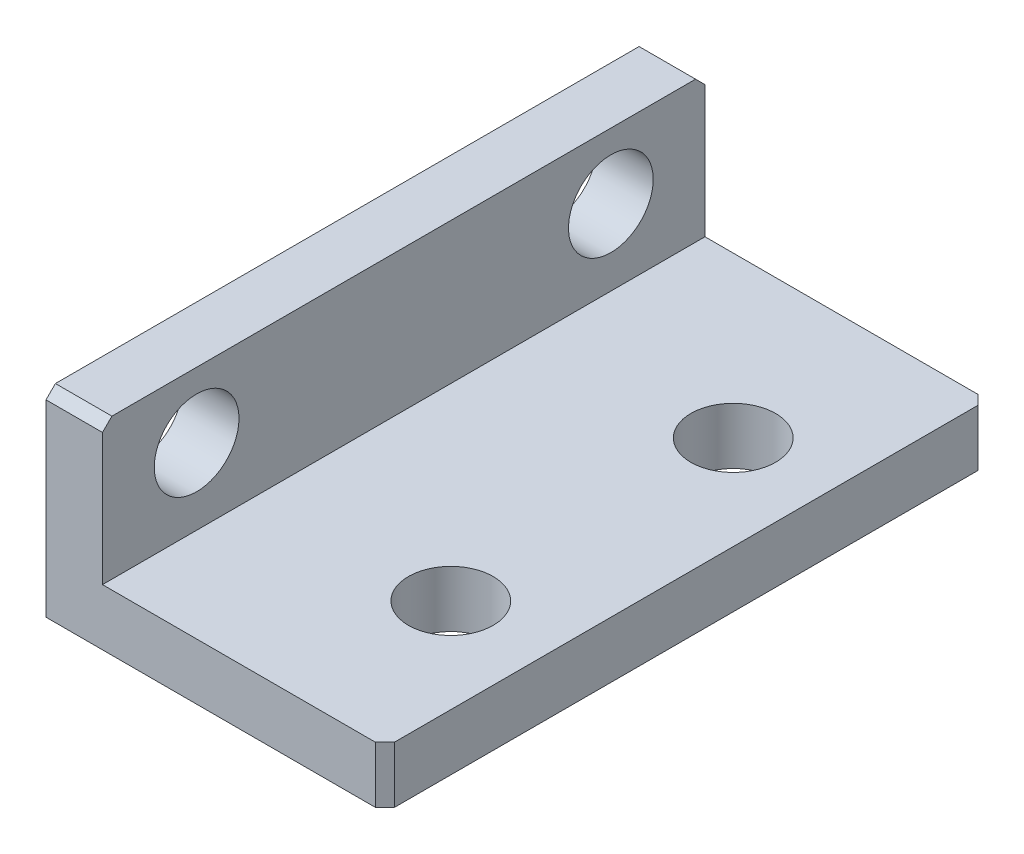
ISO-10303-21;
HEADER;
FILE_DESCRIPTION(('STEP AP214'),'2;1');
FILE_NAME('part.step','',(''),(''),'','','');
FILE_SCHEMA(('AUTOMOTIVE_DESIGN { 1 0 10303 214 1 1 1 1 }'));
ENDSEC;
DATA;
#1=APPLICATION_CONTEXT('core data for automotive mechanical design processes');
#2=APPLICATION_PROTOCOL_DEFINITION('international standard','automotive_design',2000,#1);
#3=PRODUCT_CONTEXT('',#1,'mechanical');
#4=PRODUCT('Part','Part','',(#3));
#5=PRODUCT_RELATED_PRODUCT_CATEGORY('part','',(#4));
#6=PRODUCT_DEFINITION_FORMATION('','',#4);
#7=PRODUCT_DEFINITION_CONTEXT('part definition',#1,'design');
#8=PRODUCT_DEFINITION('design','',#6,#7);
#9=PRODUCT_DEFINITION_SHAPE('','',#8);
#10=(LENGTH_UNIT() NAMED_UNIT(*) SI_UNIT(.MILLI.,.METRE.));
#11=(NAMED_UNIT(*) PLANE_ANGLE_UNIT() SI_UNIT($,.RADIAN.));
#12=(NAMED_UNIT(*) SI_UNIT($,.STERADIAN.) SOLID_ANGLE_UNIT());
#13=UNCERTAINTY_MEASURE_WITH_UNIT(LENGTH_MEASURE(1.E-05),#10,'distance_accuracy_value','');
#14=(GEOMETRIC_REPRESENTATION_CONTEXT(3) GLOBAL_UNCERTAINTY_ASSIGNED_CONTEXT((#13)) GLOBAL_UNIT_ASSIGNED_CONTEXT((#10,
#11,#12)) REPRESENTATION_CONTEXT('',''));
#15=CARTESIAN_POINT('',(0.,0.,0.));
#16=DIRECTION('',(0.,0.,1.));
#17=DIRECTION('',(1.,0.,0.));
#18=AXIS2_PLACEMENT_3D('',#15,#16,#17);
#19=CARTESIAN_POINT('',(0.,-3.,16.));
#20=DIRECTION('',(0.,1.,0.));
#21=DIRECTION('',(0.,0.,1.));
#22=AXIS2_PLACEMENT_3D('',#19,#20,#21);
#23=PLANE('',#22);
#24=CARTESIAN_POINT('',(10.,-3.,7.5));
#25=DIRECTION('',(0.,1.,0.));
#26=DIRECTION('',(0.,0.,1.));
#27=AXIS2_PLACEMENT_3D('',#24,#25,#26);
#28=CIRCLE('',#27,2.24999999999999);
#29=CARTESIAN_POINT('',(10.,-3.,9.74999999999999));
#30=VERTEX_POINT('',#29);
#31=EDGE_CURVE('E280',#30,#30,#28,.T.);
#32=ORIENTED_EDGE('',*,*,#31,.T.);
#33=EDGE_LOOP('',(#32));
#34=FACE_BOUND('',#33,.T.);
#35=CARTESIAN_POINT('',(10.,-3.,-7.5));
#36=DIRECTION('',(0.,1.,0.));
#37=DIRECTION('',(0.,0.,1.));
#38=AXIS2_PLACEMENT_3D('',#35,#36,#37);
#39=CIRCLE('',#38,2.24999999999999);
#40=CARTESIAN_POINT('',(10.,-3.,-5.25000000000001));
#41=VERTEX_POINT('',#40);
#42=EDGE_CURVE('E274',#41,#41,#39,.T.);
#43=ORIENTED_EDGE('',*,*,#42,.T.);
#44=EDGE_LOOP('',(#43));
#45=FACE_BOUND('',#44,.T.);
#46=DIRECTION('',(1.,0.,0.));
#47=VECTOR('',#46,1.);
#48=CARTESIAN_POINT('',(0.,-3.,-16.));
#49=LINE('',#48,#47);
#50=CARTESIAN_POINT('',(-3.,-3.,-16.));
#51=VERTEX_POINT('',#50);
#52=CARTESIAN_POINT('',(14.5,-3.,-16.));
#53=VERTEX_POINT('',#52);
#54=EDGE_CURVE('E148',#51,#53,#49,.T.);
#55=ORIENTED_EDGE('',*,*,#54,.T.);
#56=DIRECTION('',(-0.707106781186548,0.,-0.707106781186548));
#57=VECTOR('',#56,1.);
#58=CARTESIAN_POINT('',(14.5,-3.,-16.));
#59=LINE('',#58,#57);
#60=CARTESIAN_POINT('',(15.,-3.,-15.5));
#61=VERTEX_POINT('',#60);
#62=EDGE_CURVE('E173',#53,#61,#59,.F.);
#63=ORIENTED_EDGE('',*,*,#62,.T.);
#64=DIRECTION('',(0.,0.,-1.));
#65=VECTOR('',#64,1.);
#66=CARTESIAN_POINT('',(15.,-3.,16.));
#67=LINE('',#66,#65);
#68=CARTESIAN_POINT('',(15.,-3.,15.5));
#69=VERTEX_POINT('',#68);
#70=EDGE_CURVE('E162',#69,#61,#67,.T.);
#71=ORIENTED_EDGE('',*,*,#70,.F.);
#72=DIRECTION('',(-0.707106781186555,0.,0.70710678118654));
#73=VECTOR('',#72,1.);
#74=CARTESIAN_POINT('',(15.,-3.,15.5));
#75=LINE('',#74,#73);
#76=CARTESIAN_POINT('',(14.5,-3.,16.));
#77=VERTEX_POINT('',#76);
#78=EDGE_CURVE('E171',#69,#77,#75,.T.);
#79=ORIENTED_EDGE('',*,*,#78,.T.);
#80=DIRECTION('',(1.,0.,0.));
#81=VECTOR('',#80,1.);
#82=CARTESIAN_POINT('',(0.,-3.,16.));
#83=LINE('',#82,#81);
#84=CARTESIAN_POINT('',(-3.,-3.,16.));
#85=VERTEX_POINT('',#84);
#86=EDGE_CURVE('E140',#85,#77,#83,.T.);
#87=ORIENTED_EDGE('',*,*,#86,.F.);
#88=DIRECTION('',(0.,0.,-1.));
#89=VECTOR('',#88,1.);
#90=CARTESIAN_POINT('',(-3.,-3.,16.));
#91=LINE('',#90,#89);
#92=EDGE_CURVE('E147',#85,#51,#91,.T.);
#93=ORIENTED_EDGE('',*,*,#92,.T.);
#94=EDGE_LOOP('',(#55,#63,#71,#79,#87,#93));
#95=FACE_BOUND('',#94,.T.);
#96=ADVANCED_FACE('F35',(#34,#45,#95),#23,.F.);
#97=CARTESIAN_POINT('',(15.,0.,16.));
#98=DIRECTION('',(1.,0.,0.));
#99=DIRECTION('',(0.,0.,-1.));
#100=AXIS2_PLACEMENT_3D('',#97,#98,#99);
#101=PLANE('',#100);
#102=ORIENTED_EDGE('',*,*,#70,.T.);
#103=DIRECTION('',(0.,1.,0.));
#104=VECTOR('',#103,1.);
#105=CARTESIAN_POINT('',(15.,0.,-15.5));
#106=LINE('',#105,#104);
#107=CARTESIAN_POINT('',(15.,0.,-15.5));
#108=VERTEX_POINT('',#107);
#109=EDGE_CURVE('E178',#61,#108,#106,.T.);
#110=ORIENTED_EDGE('',*,*,#109,.T.);
#111=DIRECTION('',(0.,0.,-1.));
#112=VECTOR('',#111,1.);
#113=CARTESIAN_POINT('',(15.,0.,16.));
#114=LINE('',#113,#112);
#115=CARTESIAN_POINT('',(15.,0.,15.5));
#116=VERTEX_POINT('',#115);
#117=EDGE_CURVE('E133',#116,#108,#114,.T.);
#118=ORIENTED_EDGE('',*,*,#117,.F.);
#119=DIRECTION('',(0.,-1.,0.));
#120=VECTOR('',#119,1.);
#121=CARTESIAN_POINT('',(15.,-3.,15.5));
#122=LINE('',#121,#120);
#123=EDGE_CURVE('E175',#116,#69,#122,.T.);
#124=ORIENTED_EDGE('',*,*,#123,.T.);
#125=EDGE_LOOP('',(#102,#110,#118,#124));
#126=FACE_BOUND('',#125,.T.);
#127=ADVANCED_FACE('F215',(#126),#101,.T.);
#128=CARTESIAN_POINT('',(0.,0.,16.));
#129=DIRECTION('',(0.,1.,0.));
#130=DIRECTION('',(0.,0.,1.));
#131=AXIS2_PLACEMENT_3D('',#128,#129,#130);
#132=PLANE('',#131);
#133=CARTESIAN_POINT('',(10.,0.,7.5));
#134=DIRECTION('',(0.,1.,0.));
#135=DIRECTION('',(0.,0.,1.));
#136=AXIS2_PLACEMENT_3D('',#133,#134,#135);
#137=CIRCLE('',#136,2.24999999999999);
#138=CARTESIAN_POINT('',(10.,0.,9.74999999999999));
#139=VERTEX_POINT('',#138);
#140=EDGE_CURVE('E297',#139,#139,#137,.T.);
#141=ORIENTED_EDGE('',*,*,#140,.F.);
#142=EDGE_LOOP('',(#141));
#143=FACE_BOUND('',#142,.T.);
#144=CARTESIAN_POINT('',(10.,0.,-7.5));
#145=DIRECTION('',(0.,1.,0.));
#146=DIRECTION('',(0.,0.,1.));
#147=AXIS2_PLACEMENT_3D('',#144,#145,#146);
#148=CIRCLE('',#147,2.24999999999999);
#149=CARTESIAN_POINT('',(10.,0.,-5.25000000000001));
#150=VERTEX_POINT('',#149);
#151=EDGE_CURVE('E271',#150,#150,#148,.T.);
#152=ORIENTED_EDGE('',*,*,#151,.F.);
#153=EDGE_LOOP('',(#152));
#154=FACE_BOUND('',#153,.T.);
#155=ORIENTED_EDGE('',*,*,#117,.T.);
#156=DIRECTION('',(0.707106781186548,0.,0.707106781186548));
#157=VECTOR('',#156,1.);
#158=CARTESIAN_POINT('',(23.25,0.,-7.25));
#159=LINE('',#158,#157);
#160=CARTESIAN_POINT('',(14.5,0.,-16.));
#161=VERTEX_POINT('',#160);
#162=EDGE_CURVE('E182',#108,#161,#159,.F.);
#163=ORIENTED_EDGE('',*,*,#162,.T.);
#164=DIRECTION('',(1.,0.,0.));
#165=VECTOR('',#164,1.);
#166=CARTESIAN_POINT('',(0.,0.,-16.));
#167=LINE('',#166,#165);
#168=CARTESIAN_POINT('',(0.,0.,-16.));
#169=VERTEX_POINT('',#168);
#170=EDGE_CURVE('E132',#169,#161,#167,.T.);
#171=ORIENTED_EDGE('',*,*,#170,.F.);
#172=DIRECTION('',(0.,0.,-1.));
#173=VECTOR('',#172,1.);
#174=CARTESIAN_POINT('',(0.,0.,16.));
#175=LINE('',#174,#173);
#176=CARTESIAN_POINT('',(0.,0.,16.));
#177=VERTEX_POINT('',#176);
#178=EDGE_CURVE('E116',#177,#169,#175,.T.);
#179=ORIENTED_EDGE('',*,*,#178,.F.);
#180=DIRECTION('',(1.,0.,0.));
#181=VECTOR('',#180,1.);
#182=CARTESIAN_POINT('',(0.,0.,16.));
#183=LINE('',#182,#181);
#184=CARTESIAN_POINT('',(14.5,0.,16.));
#185=VERTEX_POINT('',#184);
#186=EDGE_CURVE('E124',#177,#185,#183,.T.);
#187=ORIENTED_EDGE('',*,*,#186,.T.);
#188=DIRECTION('',(0.707106781186555,0.,-0.70710678118654));
#189=VECTOR('',#188,1.);
#190=CARTESIAN_POINT('',(7.24999999999985,0.,23.25));
#191=LINE('',#190,#189);
#192=EDGE_CURVE('E180',#185,#116,#191,.T.);
#193=ORIENTED_EDGE('',*,*,#192,.T.);
#194=EDGE_LOOP('',(#155,#163,#171,#179,#187,#193));
#195=FACE_BOUND('',#194,.T.);
#196=ADVANCED_FACE('F129',(#143,#154,#195),#132,.T.);
#197=CARTESIAN_POINT('',(0.,0.,16.));
#198=DIRECTION('',(1.,0.,0.));
#199=DIRECTION('',(0.,0.,-1.));
#200=AXIS2_PLACEMENT_3D('',#197,#198,#199);
#201=PLANE('',#200);
#202=CARTESIAN_POINT('',(0.,4.02100000000052,-10.9999999999998));
#203=DIRECTION('',(1.,0.,0.));
#204=DIRECTION('',(0.,0.,-1.));
#205=AXIS2_PLACEMENT_3D('',#202,#203,#204);
#206=CIRCLE('',#205,2.24999999999999);
#207=CARTESIAN_POINT('',(0.,4.02100000000052,-13.2499999999998));
#208=VERTEX_POINT('',#207);
#209=EDGE_CURVE('E275',#208,#208,#206,.T.);
#210=ORIENTED_EDGE('',*,*,#209,.F.);
#211=EDGE_LOOP('',(#210));
#212=FACE_BOUND('',#211,.T.);
#213=CARTESIAN_POINT('',(0.,4.02100000000052,11.0000000000002));
#214=DIRECTION('',(1.,0.,0.));
#215=DIRECTION('',(0.,0.,-1.));
#216=AXIS2_PLACEMENT_3D('',#213,#214,#215);
#217=CIRCLE('',#216,2.24999999999999);
#218=CARTESIAN_POINT('',(0.,4.02100000000052,8.7500000000002));
#219=VERTEX_POINT('',#218);
#220=EDGE_CURVE('E286',#219,#219,#217,.T.);
#221=ORIENTED_EDGE('',*,*,#220,.F.);
#222=EDGE_LOOP('',(#221));
#223=FACE_BOUND('',#222,.T.);
#224=DIRECTION('',(0.,-1.,0.));
#225=VECTOR('',#224,1.);
#226=CARTESIAN_POINT('',(0.,0.,-16.));
#227=LINE('',#226,#225);
#228=CARTESIAN_POINT('',(0.,6.99999999999999,-16.));
#229=VERTEX_POINT('',#228);
#230=EDGE_CURVE('E153',#229,#169,#227,.T.);
#231=ORIENTED_EDGE('',*,*,#230,.F.);
#232=DIRECTION('',(0.,-0.707106781186548,-0.707106781186548));
#233=VECTOR('',#232,1.);
#234=CARTESIAN_POINT('',(0.,19.5,-3.5));
#235=LINE('',#234,#233);
#236=CARTESIAN_POINT('',(0.,7.5,-15.5));
#237=VERTEX_POINT('',#236);
#238=EDGE_CURVE('E188',#229,#237,#235,.F.);
#239=ORIENTED_EDGE('',*,*,#238,.T.);
#240=DIRECTION('',(0.,0.,-1.));
#241=VECTOR('',#240,1.);
#242=CARTESIAN_POINT('',(0.,7.5,16.));
#243=LINE('',#242,#241);
#244=CARTESIAN_POINT('',(0.,7.5,15.5));
#245=VERTEX_POINT('',#244);
#246=EDGE_CURVE('E134',#245,#237,#243,.T.);
#247=ORIENTED_EDGE('',*,*,#246,.F.);
#248=DIRECTION('',(0.,-0.707106781186555,0.70710678118654));
#249=VECTOR('',#248,1.);
#250=CARTESIAN_POINT('',(0.,3.49999999999992,19.5));
#251=LINE('',#250,#249);
#252=CARTESIAN_POINT('',(0.,7.,16.));
#253=VERTEX_POINT('',#252);
#254=EDGE_CURVE('E119',#245,#253,#251,.T.);
#255=ORIENTED_EDGE('',*,*,#254,.T.);
#256=DIRECTION('',(0.,-1.,0.));
#257=VECTOR('',#256,1.);
#258=CARTESIAN_POINT('',(0.,0.,16.));
#259=LINE('',#258,#257);
#260=EDGE_CURVE('E112',#253,#177,#259,.T.);
#261=ORIENTED_EDGE('',*,*,#260,.T.);
#262=ORIENTED_EDGE('',*,*,#178,.T.);
#263=EDGE_LOOP('',(#231,#239,#247,#255,#261,#262));
#264=FACE_BOUND('',#263,.T.);
#265=ADVANCED_FACE('F115',(#212,#223,#264),#201,.T.);
#266=CARTESIAN_POINT('',(-3.,7.5,16.));
#267=DIRECTION('',(0.,1.,0.));
#268=DIRECTION('',(0.,0.,1.));
#269=AXIS2_PLACEMENT_3D('',#266,#267,#268);
#270=PLANE('',#269);
#271=ORIENTED_EDGE('',*,*,#246,.T.);
#272=DIRECTION('',(-1.,0.,0.));
#273=VECTOR('',#272,1.);
#274=CARTESIAN_POINT('',(-3.,7.5,-15.5));
#275=LINE('',#274,#273);
#276=CARTESIAN_POINT('',(-3.,7.5,-15.5));
#277=VERTEX_POINT('',#276);
#278=EDGE_CURVE('E50',#237,#277,#275,.T.);
#279=ORIENTED_EDGE('',*,*,#278,.T.);
#280=DIRECTION('',(0.,0.,-1.));
#281=VECTOR('',#280,1.);
#282=CARTESIAN_POINT('',(-3.,7.5,16.));
#283=LINE('',#282,#281);
#284=CARTESIAN_POINT('',(-3.,7.5,15.5));
#285=VERTEX_POINT('',#284);
#286=EDGE_CURVE('E158',#285,#277,#283,.T.);
#287=ORIENTED_EDGE('',*,*,#286,.F.);
#288=DIRECTION('',(1.,0.,0.));
#289=VECTOR('',#288,1.);
#290=CARTESIAN_POINT('',(0.,7.5,15.5));
#291=LINE('',#290,#289);
#292=EDGE_CURVE('E190',#285,#245,#291,.T.);
#293=ORIENTED_EDGE('',*,*,#292,.T.);
#294=EDGE_LOOP('',(#271,#279,#287,#293));
#295=FACE_BOUND('',#294,.T.);
#296=ADVANCED_FACE('F194',(#295),#270,.T.);
#297=CARTESIAN_POINT('',(-3.,0.,16.));
#298=DIRECTION('',(1.,0.,0.));
#299=DIRECTION('',(0.,0.,-1.));
#300=AXIS2_PLACEMENT_3D('',#297,#298,#299);
#301=PLANE('',#300);
#302=CARTESIAN_POINT('',(-3.,4.02100000000052,-10.9999999999998));
#303=DIRECTION('',(1.,0.,0.));
#304=DIRECTION('',(0.,0.,-1.));
#305=AXIS2_PLACEMENT_3D('',#302,#303,#304);
#306=CIRCLE('',#305,2.24999999999999);
#307=CARTESIAN_POINT('',(-3.,4.02100000000052,-13.2499999999998));
#308=VERTEX_POINT('',#307);
#309=EDGE_CURVE('E278',#308,#308,#306,.T.);
#310=ORIENTED_EDGE('',*,*,#309,.T.);
#311=EDGE_LOOP('',(#310));
#312=FACE_BOUND('',#311,.T.);
#313=CARTESIAN_POINT('',(-3.,4.02100000000052,11.0000000000002));
#314=DIRECTION('',(1.,0.,0.));
#315=DIRECTION('',(0.,0.,-1.));
#316=AXIS2_PLACEMENT_3D('',#313,#314,#315);
#317=CIRCLE('',#316,2.24999999999999);
#318=CARTESIAN_POINT('',(-3.,4.02100000000052,8.75000000000021));
#319=VERTEX_POINT('',#318);
#320=EDGE_CURVE('E151',#319,#319,#317,.T.);
#321=ORIENTED_EDGE('',*,*,#320,.T.);
#322=EDGE_LOOP('',(#321));
#323=FACE_BOUND('',#322,.T.);
#324=ORIENTED_EDGE('',*,*,#286,.T.);
#325=DIRECTION('',(0.,0.707106781186548,0.707106781186548));
#326=VECTOR('',#325,1.);
#327=CARTESIAN_POINT('',(-3.,7.,-16.));
#328=LINE('',#327,#326);
#329=CARTESIAN_POINT('',(-3.,7.,-16.));
#330=VERTEX_POINT('',#329);
#331=EDGE_CURVE('E11',#277,#330,#328,.F.);
#332=ORIENTED_EDGE('',*,*,#331,.T.);
#333=DIRECTION('',(0.,1.,0.));
#334=VECTOR('',#333,1.);
#335=CARTESIAN_POINT('',(-3.,0.,-16.));
#336=LINE('',#335,#334);
#337=EDGE_CURVE('E142',#330,#51,#336,.F.);
#338=ORIENTED_EDGE('',*,*,#337,.T.);
#339=ORIENTED_EDGE('',*,*,#92,.F.);
#340=DIRECTION('',(0.,1.,0.));
#341=VECTOR('',#340,1.);
#342=CARTESIAN_POINT('',(-3.,0.,16.));
#343=LINE('',#342,#341);
#344=CARTESIAN_POINT('',(-3.,7.,16.));
#345=VERTEX_POINT('',#344);
#346=EDGE_CURVE('E123',#345,#85,#343,.F.);
#347=ORIENTED_EDGE('',*,*,#346,.F.);
#348=DIRECTION('',(0.,0.707106781186555,-0.70710678118654));
#349=VECTOR('',#348,1.);
#350=CARTESIAN_POINT('',(-3.,7.5,15.5));
#351=LINE('',#350,#349);
#352=EDGE_CURVE('E43',#345,#285,#351,.T.);
#353=ORIENTED_EDGE('',*,*,#352,.T.);
#354=EDGE_LOOP('',(#324,#332,#338,#339,#347,#353));
#355=FACE_BOUND('',#354,.T.);
#356=ADVANCED_FACE('F205',(#312,#323,#355),#301,.F.);
#357=CARTESIAN_POINT('',(0.,0.,16.));
#358=DIRECTION('',(0.,0.,-1.));
#359=DIRECTION('',(-1.,0.,0.));
#360=AXIS2_PLACEMENT_3D('',#357,#358,#359);
#361=PLANE('',#360);
#362=ORIENTED_EDGE('',*,*,#86,.T.);
#363=DIRECTION('',(0.,1.,0.));
#364=VECTOR('',#363,1.);
#365=CARTESIAN_POINT('',(14.5,0.,16.));
#366=LINE('',#365,#364);
#367=EDGE_CURVE('E139',#77,#185,#366,.T.);
#368=ORIENTED_EDGE('',*,*,#367,.T.);
#369=ORIENTED_EDGE('',*,*,#186,.F.);
#370=ORIENTED_EDGE('',*,*,#260,.F.);
#371=DIRECTION('',(-1.,0.,0.));
#372=VECTOR('',#371,1.);
#373=CARTESIAN_POINT('',(-3.,7.,16.));
#374=LINE('',#373,#372);
#375=EDGE_CURVE('E184',#253,#345,#374,.T.);
#376=ORIENTED_EDGE('',*,*,#375,.T.);
#377=ORIENTED_EDGE('',*,*,#346,.T.);
#378=EDGE_LOOP('',(#362,#368,#369,#370,#376,#377));
#379=FACE_BOUND('',#378,.T.);
#380=ADVANCED_FACE('F137',(#379),#361,.F.);
#381=CARTESIAN_POINT('',(0.,0.,-16.));
#382=DIRECTION('',(0.,0.,-1.));
#383=DIRECTION('',(-1.,0.,0.));
#384=AXIS2_PLACEMENT_3D('',#381,#382,#383);
#385=PLANE('',#384);
#386=ORIENTED_EDGE('',*,*,#170,.T.);
#387=DIRECTION('',(0.,-1.,0.));
#388=VECTOR('',#387,1.);
#389=CARTESIAN_POINT('',(14.5,0.,-16.));
#390=LINE('',#389,#388);
#391=EDGE_CURVE('E168',#161,#53,#390,.T.);
#392=ORIENTED_EDGE('',*,*,#391,.T.);
#393=ORIENTED_EDGE('',*,*,#54,.F.);
#394=ORIENTED_EDGE('',*,*,#337,.F.);
#395=DIRECTION('',(1.,0.,0.));
#396=VECTOR('',#395,1.);
#397=CARTESIAN_POINT('',(0.,7.,-16.));
#398=LINE('',#397,#396);
#399=EDGE_CURVE('E165',#330,#229,#398,.T.);
#400=ORIENTED_EDGE('',*,*,#399,.T.);
#401=ORIENTED_EDGE('',*,*,#230,.T.);
#402=EDGE_LOOP('',(#386,#392,#393,#394,#400,#401));
#403=FACE_BOUND('',#402,.T.);
#404=ADVANCED_FACE('F202',(#403),#385,.T.);
#405=CARTESIAN_POINT('',(0.,4.02100000000052,11.0000000000002));
#406=DIRECTION('',(1.,0.,0.));
#407=DIRECTION('',(0.,0.,-1.));
#408=AXIS2_PLACEMENT_3D('',#405,#406,#407);
#409=CYLINDRICAL_SURFACE('',#408,2.24999999999999);
#410=ORIENTED_EDGE('',*,*,#220,.T.);
#411=EDGE_LOOP('',(#410));
#412=FACE_BOUND('',#411,.T.);
#413=ORIENTED_EDGE('',*,*,#320,.F.);
#414=EDGE_LOOP('',(#413));
#415=FACE_BOUND('',#414,.T.);
#416=ADVANCED_FACE('F254',(#412,#415),#409,.F.);
#417=CARTESIAN_POINT('',(0.,4.02100000000052,-10.9999999999998));
#418=DIRECTION('',(1.,0.,0.));
#419=DIRECTION('',(0.,0.,-1.));
#420=AXIS2_PLACEMENT_3D('',#417,#418,#419);
#421=CYLINDRICAL_SURFACE('',#420,2.24999999999999);
#422=ORIENTED_EDGE('',*,*,#209,.T.);
#423=EDGE_LOOP('',(#422));
#424=FACE_BOUND('',#423,.T.);
#425=ORIENTED_EDGE('',*,*,#309,.F.);
#426=EDGE_LOOP('',(#425));
#427=FACE_BOUND('',#426,.T.);
#428=ADVANCED_FACE('F259',(#424,#427),#421,.F.);
#429=CARTESIAN_POINT('',(10.,0.,-7.5));
#430=DIRECTION('',(0.,1.,0.));
#431=DIRECTION('',(0.,0.,1.));
#432=AXIS2_PLACEMENT_3D('',#429,#430,#431);
#433=CYLINDRICAL_SURFACE('',#432,2.24999999999999);
#434=ORIENTED_EDGE('',*,*,#151,.T.);
#435=EDGE_LOOP('',(#434));
#436=FACE_BOUND('',#435,.T.);
#437=ORIENTED_EDGE('',*,*,#42,.F.);
#438=EDGE_LOOP('',(#437));
#439=FACE_BOUND('',#438,.T.);
#440=ADVANCED_FACE('F228',(#436,#439),#433,.F.);
#441=CARTESIAN_POINT('',(10.,0.,7.5));
#442=DIRECTION('',(0.,1.,0.));
#443=DIRECTION('',(0.,0.,1.));
#444=AXIS2_PLACEMENT_3D('',#441,#442,#443);
#445=CYLINDRICAL_SURFACE('',#444,2.24999999999999);
#446=ORIENTED_EDGE('',*,*,#140,.T.);
#447=EDGE_LOOP('',(#446));
#448=FACE_BOUND('',#447,.T.);
#449=ORIENTED_EDGE('',*,*,#31,.F.);
#450=EDGE_LOOP('',(#449));
#451=FACE_BOUND('',#450,.T.);
#452=ADVANCED_FACE('F221',(#448,#451),#445,.F.);
#453=CARTESIAN_POINT('',(14.5,0.,-16.));
#454=DIRECTION('',(-0.707106781186547,0.,0.707106781186547));
#455=DIRECTION('',(0.,-1.,0.));
#456=AXIS2_PLACEMENT_3D('',#453,#454,#455);
#457=PLANE('',#456);
#458=ORIENTED_EDGE('',*,*,#162,.F.);
#459=ORIENTED_EDGE('',*,*,#109,.F.);
#460=ORIENTED_EDGE('',*,*,#62,.F.);
#461=ORIENTED_EDGE('',*,*,#391,.F.);
#462=EDGE_LOOP('',(#458,#459,#460,#461));
#463=FACE_BOUND('',#462,.T.);
#464=ADVANCED_FACE('F218',(#463),#457,.F.);
#465=CARTESIAN_POINT('',(15.,0.,15.5));
#466=DIRECTION('',(0.70710678118654,0.,0.707106781186555));
#467=DIRECTION('',(0.,1.,0.));
#468=AXIS2_PLACEMENT_3D('',#465,#466,#467);
#469=PLANE('',#468);
#470=ORIENTED_EDGE('',*,*,#192,.F.);
#471=ORIENTED_EDGE('',*,*,#367,.F.);
#472=ORIENTED_EDGE('',*,*,#78,.F.);
#473=ORIENTED_EDGE('',*,*,#123,.F.);
#474=EDGE_LOOP('',(#470,#471,#472,#473));
#475=FACE_BOUND('',#474,.T.);
#476=ADVANCED_FACE('F210',(#475),#469,.T.);
#477=CARTESIAN_POINT('',(0.,7.,-16.));
#478=DIRECTION('',(0.,-0.707106781186547,0.707106781186547));
#479=DIRECTION('',(1.,0.,0.));
#480=AXIS2_PLACEMENT_3D('',#477,#478,#479);
#481=PLANE('',#480);
#482=ORIENTED_EDGE('',*,*,#331,.F.);
#483=ORIENTED_EDGE('',*,*,#278,.F.);
#484=ORIENTED_EDGE('',*,*,#238,.F.);
#485=ORIENTED_EDGE('',*,*,#399,.F.);
#486=EDGE_LOOP('',(#482,#483,#484,#485));
#487=FACE_BOUND('',#486,.T.);
#488=ADVANCED_FACE('F199',(#487),#481,.F.);
#489=CARTESIAN_POINT('',(-3.,7.5,15.5));
#490=DIRECTION('',(0.,0.70710678118654,0.707106781186555));
#491=DIRECTION('',(-1.,0.,0.));
#492=AXIS2_PLACEMENT_3D('',#489,#490,#491);
#493=PLANE('',#492);
#494=ORIENTED_EDGE('',*,*,#352,.F.);
#495=ORIENTED_EDGE('',*,*,#375,.F.);
#496=ORIENTED_EDGE('',*,*,#254,.F.);
#497=ORIENTED_EDGE('',*,*,#292,.F.);
#498=EDGE_LOOP('',(#494,#495,#496,#497));
#499=FACE_BOUND('',#498,.T.);
#500=ADVANCED_FACE('F37',(#499),#493,.T.);
#501=CLOSED_SHELL('',(#96,#127,#196,#265,#296,#356,#380,#404,#416,#428,#440,#452,#464,#476,#488,#500));
#502=MANIFOLD_SOLID_BREP('B2',#501);
#503=ADVANCED_BREP_SHAPE_REPRESENTATION('',(#18,#502),#14);
#504=SHAPE_DEFINITION_REPRESENTATION(#9,#503);
ENDSEC;
END-ISO-10303-21;
